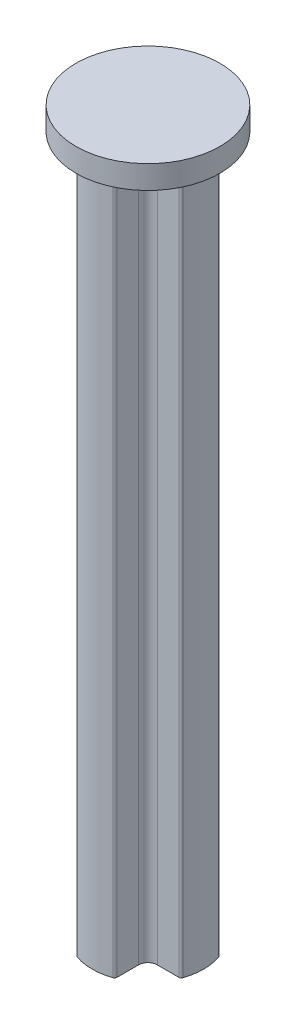
ISO-10303-21;
HEADER;
FILE_DESCRIPTION(('STEP AP214'),'2;1');
FILE_NAME('part.step','',(''),(''),'','','');
FILE_SCHEMA(('AUTOMOTIVE_DESIGN { 1 0 10303 214 1 1 1 1 }'));
ENDSEC;
DATA;
#1=APPLICATION_CONTEXT('core data for automotive mechanical design processes');
#2=APPLICATION_PROTOCOL_DEFINITION('international standard','automotive_design',2000,#1);
#3=PRODUCT_CONTEXT('',#1,'mechanical');
#4=PRODUCT('Part','Part','',(#3));
#5=PRODUCT_RELATED_PRODUCT_CATEGORY('part','',(#4));
#6=PRODUCT_DEFINITION_FORMATION('','',#4);
#7=PRODUCT_DEFINITION_CONTEXT('part definition',#1,'design');
#8=PRODUCT_DEFINITION('design','',#6,#7);
#9=PRODUCT_DEFINITION_SHAPE('','',#8);
#10=(LENGTH_UNIT() NAMED_UNIT(*) SI_UNIT(.MILLI.,.METRE.));
#11=(NAMED_UNIT(*) PLANE_ANGLE_UNIT() SI_UNIT($,.RADIAN.));
#12=(NAMED_UNIT(*) SI_UNIT($,.STERADIAN.) SOLID_ANGLE_UNIT());
#13=UNCERTAINTY_MEASURE_WITH_UNIT(LENGTH_MEASURE(1.E-05),#10,'distance_accuracy_value','');
#14=(GEOMETRIC_REPRESENTATION_CONTEXT(3) GLOBAL_UNCERTAINTY_ASSIGNED_CONTEXT((#13)) GLOBAL_UNIT_ASSIGNED_CONTEXT((#10,
#11,#12)) REPRESENTATION_CONTEXT('',''));
#15=CARTESIAN_POINT('',(0.,0.,0.));
#16=DIRECTION('',(0.,0.,1.));
#17=DIRECTION('',(1.,0.,0.));
#18=AXIS2_PLACEMENT_3D('',#15,#16,#17);
#19=CARTESIAN_POINT('',(0.,31.,0.));
#20=DIRECTION('',(0.,-1.,0.));
#21=DIRECTION('',(0.,0.,-1.));
#22=AXIS2_PLACEMENT_3D('',#19,#20,#21);
#23=CYLINDRICAL_SURFACE('',#22,3.1);
#24=CARTESIAN_POINT('',(0.,30.,0.));
#25=DIRECTION('',(0.,1.,0.));
#26=DIRECTION('',(0.,0.,1.));
#27=AXIS2_PLACEMENT_3D('',#24,#25,#26);
#28=CIRCLE('',#27,3.1);
#29=CARTESIAN_POINT('',(0.,30.,3.1));
#30=VERTEX_POINT('',#29);
#31=EDGE_CURVE('E47',#30,#30,#28,.T.);
#32=ORIENTED_EDGE('',*,*,#31,.T.);
#33=EDGE_LOOP('',(#32));
#34=FACE_BOUND('',#33,.T.);
#35=CARTESIAN_POINT('',(0.,31.,0.));
#36=DIRECTION('',(0.,1.,0.));
#37=DIRECTION('',(0.,0.,1.));
#38=AXIS2_PLACEMENT_3D('',#35,#36,#37);
#39=CIRCLE('',#38,3.1);
#40=CARTESIAN_POINT('',(0.,31.,3.1));
#41=VERTEX_POINT('',#40);
#42=EDGE_CURVE('E11',#41,#41,#39,.T.);
#43=ORIENTED_EDGE('',*,*,#42,.F.);
#44=EDGE_LOOP('',(#43));
#45=FACE_BOUND('',#44,.T.);
#46=ADVANCED_FACE('F39',(#34,#45),#23,.T.);
#47=CARTESIAN_POINT('',(0.,31.,0.));
#48=DIRECTION('',(0.,1.,0.));
#49=DIRECTION('',(0.,0.,1.));
#50=AXIS2_PLACEMENT_3D('',#47,#48,#49);
#51=PLANE('',#50);
#52=ORIENTED_EDGE('',*,*,#42,.T.);
#53=EDGE_LOOP('',(#52));
#54=FACE_BOUND('',#53,.T.);
#55=ADVANCED_FACE('F455',(#54),#51,.T.);
#56=CARTESIAN_POINT('',(0.,30.,0.));
#57=DIRECTION('',(0.,1.,0.));
#58=DIRECTION('',(0.,0.,1.));
#59=AXIS2_PLACEMENT_3D('',#56,#57,#58);
#60=PLANE('',#59);
#61=ORIENTED_EDGE('',*,*,#31,.F.);
#62=EDGE_LOOP('',(#61));
#63=FACE_BOUND('',#62,.T.);
#64=CARTESIAN_POINT('',(0.,30.,0.));
#65=DIRECTION('',(0.,1.,0.));
#66=DIRECTION('',(0.,0.,1.));
#67=AXIS2_PLACEMENT_3D('',#64,#65,#66);
#68=CIRCLE('',#67,2.4);
#69=CARTESIAN_POINT('',(-2.27238804961105,30.,-0.772173913043479));
#70=VERTEX_POINT('',#69);
#71=CARTESIAN_POINT('',(-2.27238804961105,30.,0.772173913043478));
#72=VERTEX_POINT('',#71);
#73=EDGE_CURVE('E202',#70,#72,#68,.T.);
#74=ORIENTED_EDGE('',*,*,#73,.T.);
#75=CARTESIAN_POINT('',(-2.17770521421059,30.,0.74));
#76=DIRECTION('',(0.,1.,0.));
#77=DIRECTION('',(0.,0.,1.));
#78=AXIS2_PLACEMENT_3D('',#75,#76,#77);
#79=CIRCLE('',#78,0.0999999999999996);
#80=CARTESIAN_POINT('',(-2.17770521421059,30.,0.84));
#81=VERTEX_POINT('',#80);
#82=EDGE_CURVE('E225',#72,#81,#79,.T.);
#83=ORIENTED_EDGE('',*,*,#82,.T.);
#84=DIRECTION('',(1.,0.,0.));
#85=VECTOR('',#84,1.);
#86=CARTESIAN_POINT('',(-2.17770521421059,30.,0.84));
#87=LINE('',#86,#85);
#88=CARTESIAN_POINT('',(-1.24,30.,0.84));
#89=VERTEX_POINT('',#88);
#90=EDGE_CURVE('E228',#81,#89,#87,.T.);
#91=ORIENTED_EDGE('',*,*,#90,.T.);
#92=CARTESIAN_POINT('',(-1.24,30.,1.24));
#93=DIRECTION('',(0.,-1.,0.));
#94=DIRECTION('',(0.,0.,1.));
#95=AXIS2_PLACEMENT_3D('',#92,#93,#94);
#96=CIRCLE('',#95,0.4);
#97=CARTESIAN_POINT('',(-0.84,30.,1.24));
#98=VERTEX_POINT('',#97);
#99=EDGE_CURVE('E233',#89,#98,#96,.T.);
#100=ORIENTED_EDGE('',*,*,#99,.T.);
#101=DIRECTION('',(0.,0.,1.));
#102=VECTOR('',#101,1.);
#103=CARTESIAN_POINT('',(-0.84,30.,1.24));
#104=LINE('',#103,#102);
#105=CARTESIAN_POINT('',(-0.84,30.,2.17770521421059));
#106=VERTEX_POINT('',#105);
#107=EDGE_CURVE('E236',#98,#106,#104,.T.);
#108=ORIENTED_EDGE('',*,*,#107,.T.);
#109=CARTESIAN_POINT('',(-0.74,30.,2.17770521421059));
#110=DIRECTION('',(0.,1.,0.));
#111=DIRECTION('',(0.,0.,1.));
#112=AXIS2_PLACEMENT_3D('',#109,#110,#111);
#113=CIRCLE('',#112,0.1);
#114=CARTESIAN_POINT('',(-0.772173913043479,30.,2.27238804961105));
#115=VERTEX_POINT('',#114);
#116=EDGE_CURVE('E239',#106,#115,#113,.T.);
#117=ORIENTED_EDGE('',*,*,#116,.T.);
#118=CARTESIAN_POINT('',(0.,30.,0.));
#119=DIRECTION('',(0.,1.,0.));
#120=DIRECTION('',(0.,0.,1.));
#121=AXIS2_PLACEMENT_3D('',#118,#119,#120);
#122=CIRCLE('',#121,2.4);
#123=CARTESIAN_POINT('',(0.772173913043478,30.,2.27238804961105));
#124=VERTEX_POINT('',#123);
#125=EDGE_CURVE('E242',#115,#124,#122,.T.);
#126=ORIENTED_EDGE('',*,*,#125,.T.);
#127=CARTESIAN_POINT('',(0.74,30.,2.17770521421059));
#128=DIRECTION('',(0.,1.,0.));
#129=DIRECTION('',(0.,0.,1.));
#130=AXIS2_PLACEMENT_3D('',#127,#128,#129);
#131=CIRCLE('',#130,0.1);
#132=CARTESIAN_POINT('',(0.84,30.,2.17770521421059));
#133=VERTEX_POINT('',#132);
#134=EDGE_CURVE('E245',#124,#133,#131,.T.);
#135=ORIENTED_EDGE('',*,*,#134,.T.);
#136=DIRECTION('',(0.,0.,-1.));
#137=VECTOR('',#136,1.);
#138=CARTESIAN_POINT('',(0.84,30.,1.24));
#139=LINE('',#138,#137);
#140=CARTESIAN_POINT('',(0.84,30.,1.24));
#141=VERTEX_POINT('',#140);
#142=EDGE_CURVE('E248',#133,#141,#139,.T.);
#143=ORIENTED_EDGE('',*,*,#142,.T.);
#144=CARTESIAN_POINT('',(1.24,30.,1.24));
#145=DIRECTION('',(0.,-1.,0.));
#146=DIRECTION('',(0.,0.,-1.));
#147=AXIS2_PLACEMENT_3D('',#144,#145,#146);
#148=CIRCLE('',#147,0.4);
#149=CARTESIAN_POINT('',(1.24,30.,0.84));
#150=VERTEX_POINT('',#149);
#151=EDGE_CURVE('E251',#141,#150,#148,.T.);
#152=ORIENTED_EDGE('',*,*,#151,.T.);
#153=DIRECTION('',(1.,0.,0.));
#154=VECTOR('',#153,1.);
#155=CARTESIAN_POINT('',(1.24,30.,0.84));
#156=LINE('',#155,#154);
#157=CARTESIAN_POINT('',(2.17770521421059,30.,0.84));
#158=VERTEX_POINT('',#157);
#159=EDGE_CURVE('E254',#150,#158,#156,.T.);
#160=ORIENTED_EDGE('',*,*,#159,.T.);
#161=CARTESIAN_POINT('',(2.17770521421059,30.,0.74));
#162=DIRECTION('',(0.,1.,0.));
#163=DIRECTION('',(0.,0.,1.));
#164=AXIS2_PLACEMENT_3D('',#161,#162,#163);
#165=CIRCLE('',#164,0.0999999999999996);
#166=CARTESIAN_POINT('',(2.27238804961105,30.,0.772173913043478));
#167=VERTEX_POINT('',#166);
#168=EDGE_CURVE('E257',#158,#167,#165,.T.);
#169=ORIENTED_EDGE('',*,*,#168,.T.);
#170=CARTESIAN_POINT('',(0.,30.,0.));
#171=DIRECTION('',(0.,1.,0.));
#172=DIRECTION('',(0.,0.,1.));
#173=AXIS2_PLACEMENT_3D('',#170,#171,#172);
#174=CIRCLE('',#173,2.4);
#175=CARTESIAN_POINT('',(2.27238804961105,30.,-0.772173913043478));
#176=VERTEX_POINT('',#175);
#177=EDGE_CURVE('E260',#167,#176,#174,.T.);
#178=ORIENTED_EDGE('',*,*,#177,.T.);
#179=CARTESIAN_POINT('',(2.17770521421059,30.,-0.74));
#180=DIRECTION('',(0.,1.,0.));
#181=DIRECTION('',(0.,0.,-1.));
#182=AXIS2_PLACEMENT_3D('',#179,#180,#181);
#183=CIRCLE('',#182,0.1);
#184=CARTESIAN_POINT('',(2.17770521421059,30.,-0.84));
#185=VERTEX_POINT('',#184);
#186=EDGE_CURVE('E263',#176,#185,#183,.T.);
#187=ORIENTED_EDGE('',*,*,#186,.T.);
#188=DIRECTION('',(-1.,0.,0.));
#189=VECTOR('',#188,1.);
#190=CARTESIAN_POINT('',(1.24,30.,-0.84));
#191=LINE('',#190,#189);
#192=CARTESIAN_POINT('',(1.24,30.,-0.84));
#193=VERTEX_POINT('',#192);
#194=EDGE_CURVE('E266',#185,#193,#191,.T.);
#195=ORIENTED_EDGE('',*,*,#194,.T.);
#196=CARTESIAN_POINT('',(1.24,30.,-1.24));
#197=DIRECTION('',(0.,-1.,0.));
#198=DIRECTION('',(0.,0.,1.));
#199=AXIS2_PLACEMENT_3D('',#196,#197,#198);
#200=CIRCLE('',#199,0.4);
#201=CARTESIAN_POINT('',(0.84,30.,-1.24));
#202=VERTEX_POINT('',#201);
#203=EDGE_CURVE('E269',#193,#202,#200,.T.);
#204=ORIENTED_EDGE('',*,*,#203,.T.);
#205=DIRECTION('',(0.,0.,-1.));
#206=VECTOR('',#205,1.);
#207=CARTESIAN_POINT('',(0.84,30.,-2.17770521421059));
#208=LINE('',#207,#206);
#209=CARTESIAN_POINT('',(0.84,30.,-2.17770521421059));
#210=VERTEX_POINT('',#209);
#211=EDGE_CURVE('E272',#202,#210,#208,.T.);
#212=ORIENTED_EDGE('',*,*,#211,.T.);
#213=CARTESIAN_POINT('',(0.74,30.,-2.17770521421059));
#214=DIRECTION('',(0.,1.,0.));
#215=DIRECTION('',(0.,0.,-1.));
#216=AXIS2_PLACEMENT_3D('',#213,#214,#215);
#217=CIRCLE('',#216,0.1);
#218=CARTESIAN_POINT('',(0.772173913043478,30.,-2.27238804961105));
#219=VERTEX_POINT('',#218);
#220=EDGE_CURVE('E275',#210,#219,#217,.T.);
#221=ORIENTED_EDGE('',*,*,#220,.T.);
#222=CARTESIAN_POINT('',(0.,30.,0.));
#223=DIRECTION('',(0.,1.,0.));
#224=DIRECTION('',(0.,0.,1.));
#225=AXIS2_PLACEMENT_3D('',#222,#223,#224);
#226=CIRCLE('',#225,2.4);
#227=CARTESIAN_POINT('',(-0.772173913043478,30.,-2.27238804961105));
#228=VERTEX_POINT('',#227);
#229=EDGE_CURVE('E278',#219,#228,#226,.T.);
#230=ORIENTED_EDGE('',*,*,#229,.T.);
#231=CARTESIAN_POINT('',(-0.74,30.,-2.17770521421059));
#232=DIRECTION('',(0.,1.,0.));
#233=DIRECTION('',(0.,0.,1.));
#234=AXIS2_PLACEMENT_3D('',#231,#232,#233);
#235=CIRCLE('',#234,0.1);
#236=CARTESIAN_POINT('',(-0.84,30.,-2.17770521421059));
#237=VERTEX_POINT('',#236);
#238=EDGE_CURVE('E281',#228,#237,#235,.T.);
#239=ORIENTED_EDGE('',*,*,#238,.T.);
#240=DIRECTION('',(0.,0.,1.));
#241=VECTOR('',#240,1.);
#242=CARTESIAN_POINT('',(-0.84,30.,-2.17770521421059));
#243=LINE('',#242,#241);
#244=CARTESIAN_POINT('',(-0.84,30.,-1.24));
#245=VERTEX_POINT('',#244);
#246=EDGE_CURVE('E284',#237,#245,#243,.T.);
#247=ORIENTED_EDGE('',*,*,#246,.T.);
#248=CARTESIAN_POINT('',(-1.24,30.,-1.24));
#249=DIRECTION('',(0.,-1.,0.));
#250=DIRECTION('',(0.,0.,-1.));
#251=AXIS2_PLACEMENT_3D('',#248,#249,#250);
#252=CIRCLE('',#251,0.4);
#253=CARTESIAN_POINT('',(-1.24,30.,-0.84));
#254=VERTEX_POINT('',#253);
#255=EDGE_CURVE('E287',#245,#254,#252,.T.);
#256=ORIENTED_EDGE('',*,*,#255,.T.);
#257=DIRECTION('',(-1.,0.,0.));
#258=VECTOR('',#257,1.);
#259=CARTESIAN_POINT('',(-2.17770521421059,30.,-0.84));
#260=LINE('',#259,#258);
#261=CARTESIAN_POINT('',(-2.17770521421059,30.,-0.84));
#262=VERTEX_POINT('',#261);
#263=EDGE_CURVE('E205',#254,#262,#260,.T.);
#264=ORIENTED_EDGE('',*,*,#263,.T.);
#265=CARTESIAN_POINT('',(-2.17770521421059,30.,-0.74));
#266=DIRECTION('',(0.,1.,0.));
#267=DIRECTION('',(0.,0.,1.));
#268=AXIS2_PLACEMENT_3D('',#265,#266,#267);
#269=CIRCLE('',#268,0.1);
#270=EDGE_CURVE('E198',#262,#70,#269,.T.);
#271=ORIENTED_EDGE('',*,*,#270,.T.);
#272=EDGE_LOOP('',(#74,#83,#91,#100,#108,#117,#126,#135,#143,#152,#160,#169,#178,#187,#195,#204,
#212,#221,#230,#239,#247,#256,#264,#271));
#273=FACE_BOUND('',#272,.T.);
#274=ADVANCED_FACE('F200',(#63,#273),#60,.F.);
#275=CARTESIAN_POINT('',(-2.17770521421059,30.,-0.74));
#276=DIRECTION('',(0.,-1.,0.));
#277=DIRECTION('',(0.,0.,-1.));
#278=AXIS2_PLACEMENT_3D('',#275,#276,#277);
#279=CYLINDRICAL_SURFACE('',#278,0.1);
#280=CARTESIAN_POINT('',(-2.17770521421059,0.,-0.74));
#281=DIRECTION('',(0.,1.,0.));
#282=DIRECTION('',(0.,0.,1.));
#283=AXIS2_PLACEMENT_3D('',#280,#281,#282);
#284=CIRCLE('',#283,0.1);
#285=CARTESIAN_POINT('',(-2.17770521421059,0.,-0.84));
#286=VERTEX_POINT('',#285);
#287=CARTESIAN_POINT('',(-2.27238804961105,0.,-0.772173913043479));
#288=VERTEX_POINT('',#287);
#289=EDGE_CURVE('E215',#286,#288,#284,.T.);
#290=ORIENTED_EDGE('',*,*,#289,.T.);
#291=DIRECTION('',(0.,-1.,0.));
#292=VECTOR('',#291,1.);
#293=CARTESIAN_POINT('',(-2.27238804961105,30.,-0.772173913043479));
#294=LINE('',#293,#292);
#295=EDGE_CURVE('E212',#70,#288,#294,.T.);
#296=ORIENTED_EDGE('',*,*,#295,.F.);
#297=ORIENTED_EDGE('',*,*,#270,.F.);
#298=DIRECTION('',(0.,-1.,0.));
#299=VECTOR('',#298,1.);
#300=CARTESIAN_POINT('',(-2.17770521421059,30.,-0.84));
#301=LINE('',#300,#299);
#302=EDGE_CURVE('E292',#262,#286,#301,.T.);
#303=ORIENTED_EDGE('',*,*,#302,.T.);
#304=EDGE_LOOP('',(#290,#296,#297,#303));
#305=FACE_BOUND('',#304,.T.);
#306=ADVANCED_FACE('F213',(#305),#279,.T.);
#307=CARTESIAN_POINT('',(0.,30.,0.));
#308=DIRECTION('',(0.,-1.,0.));
#309=DIRECTION('',(0.,0.,-1.));
#310=AXIS2_PLACEMENT_3D('',#307,#308,#309);
#311=CYLINDRICAL_SURFACE('',#310,2.4);
#312=CARTESIAN_POINT('',(0.,0.,0.));
#313=DIRECTION('',(0.,1.,0.));
#314=DIRECTION('',(0.,0.,1.));
#315=AXIS2_PLACEMENT_3D('',#312,#313,#314);
#316=CIRCLE('',#315,2.4);
#317=CARTESIAN_POINT('',(-2.27238804961105,0.,0.772173913043478));
#318=VERTEX_POINT('',#317);
#319=EDGE_CURVE('E295',#288,#318,#316,.T.);
#320=ORIENTED_EDGE('',*,*,#319,.T.);
#321=DIRECTION('',(0.,-1.,0.));
#322=VECTOR('',#321,1.);
#323=CARTESIAN_POINT('',(-2.27238804961105,30.,0.772173913043478));
#324=LINE('',#323,#322);
#325=EDGE_CURVE('E220',#72,#318,#324,.T.);
#326=ORIENTED_EDGE('',*,*,#325,.F.);
#327=ORIENTED_EDGE('',*,*,#73,.F.);
#328=ORIENTED_EDGE('',*,*,#295,.T.);
#329=EDGE_LOOP('',(#320,#326,#327,#328));
#330=FACE_BOUND('',#329,.T.);
#331=ADVANCED_FACE('F222',(#330),#311,.T.);
#332=CARTESIAN_POINT('',(-2.17770521421059,30.,0.74));
#333=DIRECTION('',(0.,-1.,0.));
#334=DIRECTION('',(0.,0.,-1.));
#335=AXIS2_PLACEMENT_3D('',#332,#333,#334);
#336=CYLINDRICAL_SURFACE('',#335,0.0999999999999996);
#337=CARTESIAN_POINT('',(-2.17770521421059,0.,0.74));
#338=DIRECTION('',(0.,1.,0.));
#339=DIRECTION('',(0.,0.,1.));
#340=AXIS2_PLACEMENT_3D('',#337,#338,#339);
#341=CIRCLE('',#340,0.0999999999999996);
#342=CARTESIAN_POINT('',(-2.17770521421059,0.,0.84));
#343=VERTEX_POINT('',#342);
#344=EDGE_CURVE('E298',#318,#343,#341,.T.);
#345=ORIENTED_EDGE('',*,*,#344,.T.);
#346=DIRECTION('',(0.,-1.,0.));
#347=VECTOR('',#346,1.);
#348=CARTESIAN_POINT('',(-2.17770521421059,30.,0.84));
#349=LINE('',#348,#347);
#350=EDGE_CURVE('E444',#81,#343,#349,.T.);
#351=ORIENTED_EDGE('',*,*,#350,.F.);
#352=ORIENTED_EDGE('',*,*,#82,.F.);
#353=ORIENTED_EDGE('',*,*,#325,.T.);
#354=EDGE_LOOP('',(#345,#351,#352,#353));
#355=FACE_BOUND('',#354,.T.);
#356=ADVANCED_FACE('F502',(#355),#336,.T.);
#357=CARTESIAN_POINT('',(-2.17770521421059,30.,0.84));
#358=DIRECTION('',(0.,0.,-1.));
#359=DIRECTION('',(-1.,0.,0.));
#360=AXIS2_PLACEMENT_3D('',#357,#358,#359);
#361=PLANE('',#360);
#362=DIRECTION('',(1.,0.,0.));
#363=VECTOR('',#362,1.);
#364=CARTESIAN_POINT('',(-2.17770521421059,0.,0.84));
#365=LINE('',#364,#363);
#366=CARTESIAN_POINT('',(-1.24,0.,0.84));
#367=VERTEX_POINT('',#366);
#368=EDGE_CURVE('E302',#343,#367,#365,.T.);
#369=ORIENTED_EDGE('',*,*,#368,.T.);
#370=DIRECTION('',(0.,-1.,0.));
#371=VECTOR('',#370,1.);
#372=CARTESIAN_POINT('',(-1.24,30.,0.84));
#373=LINE('',#372,#371);
#374=EDGE_CURVE('E441',#89,#367,#373,.T.);
#375=ORIENTED_EDGE('',*,*,#374,.F.);
#376=ORIENTED_EDGE('',*,*,#90,.F.);
#377=ORIENTED_EDGE('',*,*,#350,.T.);
#378=EDGE_LOOP('',(#369,#375,#376,#377));
#379=FACE_BOUND('',#378,.T.);
#380=ADVANCED_FACE('F510',(#379),#361,.F.);
#381=CARTESIAN_POINT('',(-1.24,30.,1.24));
#382=DIRECTION('',(0.,-1.,0.));
#383=DIRECTION('',(0.,0.,-1.));
#384=AXIS2_PLACEMENT_3D('',#381,#382,#383);
#385=CYLINDRICAL_SURFACE('',#384,0.4);
#386=CARTESIAN_POINT('',(-1.24,0.,1.24));
#387=DIRECTION('',(0.,-1.,0.));
#388=DIRECTION('',(0.,0.,1.));
#389=AXIS2_PLACEMENT_3D('',#386,#387,#388);
#390=CIRCLE('',#389,0.4);
#391=CARTESIAN_POINT('',(-0.84,0.,1.24));
#392=VERTEX_POINT('',#391);
#393=EDGE_CURVE('E306',#367,#392,#390,.T.);
#394=ORIENTED_EDGE('',*,*,#393,.T.);
#395=DIRECTION('',(0.,-1.,0.));
#396=VECTOR('',#395,1.);
#397=CARTESIAN_POINT('',(-0.84,30.,1.24));
#398=LINE('',#397,#396);
#399=EDGE_CURVE('E438',#98,#392,#398,.T.);
#400=ORIENTED_EDGE('',*,*,#399,.F.);
#401=ORIENTED_EDGE('',*,*,#99,.F.);
#402=ORIENTED_EDGE('',*,*,#374,.T.);
#403=EDGE_LOOP('',(#394,#400,#401,#402));
#404=FACE_BOUND('',#403,.T.);
#405=ADVANCED_FACE('F519',(#404),#385,.F.);
#406=CARTESIAN_POINT('',(-0.84,30.,1.24));
#407=DIRECTION('',(1.,0.,0.));
#408=DIRECTION('',(0.,0.,-1.));
#409=AXIS2_PLACEMENT_3D('',#406,#407,#408);
#410=PLANE('',#409);
#411=DIRECTION('',(0.,0.,1.));
#412=VECTOR('',#411,1.);
#413=CARTESIAN_POINT('',(-0.84,0.,1.24));
#414=LINE('',#413,#412);
#415=CARTESIAN_POINT('',(-0.84,0.,2.17770521421059));
#416=VERTEX_POINT('',#415);
#417=EDGE_CURVE('E310',#392,#416,#414,.T.);
#418=ORIENTED_EDGE('',*,*,#417,.T.);
#419=DIRECTION('',(0.,-1.,0.));
#420=VECTOR('',#419,1.);
#421=CARTESIAN_POINT('',(-0.84,30.,2.17770521421059));
#422=LINE('',#421,#420);
#423=EDGE_CURVE('E435',#106,#416,#422,.T.);
#424=ORIENTED_EDGE('',*,*,#423,.F.);
#425=ORIENTED_EDGE('',*,*,#107,.F.);
#426=ORIENTED_EDGE('',*,*,#399,.T.);
#427=EDGE_LOOP('',(#418,#424,#425,#426));
#428=FACE_BOUND('',#427,.T.);
#429=ADVANCED_FACE('F528',(#428),#410,.F.);
#430=CARTESIAN_POINT('',(-0.74,30.,2.17770521421059));
#431=DIRECTION('',(0.,-1.,0.));
#432=DIRECTION('',(0.,0.,-1.));
#433=AXIS2_PLACEMENT_3D('',#430,#431,#432);
#434=CYLINDRICAL_SURFACE('',#433,0.1);
#435=CARTESIAN_POINT('',(-0.74,0.,2.17770521421059));
#436=DIRECTION('',(0.,1.,0.));
#437=DIRECTION('',(0.,0.,1.));
#438=AXIS2_PLACEMENT_3D('',#435,#436,#437);
#439=CIRCLE('',#438,0.1);
#440=CARTESIAN_POINT('',(-0.772173913043479,0.,2.27238804961105));
#441=VERTEX_POINT('',#440);
#442=EDGE_CURVE('E314',#416,#441,#439,.T.);
#443=ORIENTED_EDGE('',*,*,#442,.T.);
#444=DIRECTION('',(0.,-1.,0.));
#445=VECTOR('',#444,1.);
#446=CARTESIAN_POINT('',(-0.772173913043479,30.,2.27238804961105));
#447=LINE('',#446,#445);
#448=EDGE_CURVE('E432',#115,#441,#447,.T.);
#449=ORIENTED_EDGE('',*,*,#448,.F.);
#450=ORIENTED_EDGE('',*,*,#116,.F.);
#451=ORIENTED_EDGE('',*,*,#423,.T.);
#452=EDGE_LOOP('',(#443,#449,#450,#451));
#453=FACE_BOUND('',#452,.T.);
#454=ADVANCED_FACE('F537',(#453),#434,.T.);
#455=CARTESIAN_POINT('',(0.,30.,0.));
#456=DIRECTION('',(0.,-1.,0.));
#457=DIRECTION('',(0.,0.,-1.));
#458=AXIS2_PLACEMENT_3D('',#455,#456,#457);
#459=CYLINDRICAL_SURFACE('',#458,2.4);
#460=CARTESIAN_POINT('',(0.,0.,0.));
#461=DIRECTION('',(0.,1.,0.));
#462=DIRECTION('',(0.,0.,1.));
#463=AXIS2_PLACEMENT_3D('',#460,#461,#462);
#464=CIRCLE('',#463,2.4);
#465=CARTESIAN_POINT('',(0.772173913043478,0.,2.27238804961105));
#466=VERTEX_POINT('',#465);
#467=EDGE_CURVE('E318',#441,#466,#464,.T.);
#468=ORIENTED_EDGE('',*,*,#467,.T.);
#469=DIRECTION('',(0.,-1.,0.));
#470=VECTOR('',#469,1.);
#471=CARTESIAN_POINT('',(0.772173913043478,30.,2.27238804961105));
#472=LINE('',#471,#470);
#473=EDGE_CURVE('E429',#124,#466,#472,.T.);
#474=ORIENTED_EDGE('',*,*,#473,.F.);
#475=ORIENTED_EDGE('',*,*,#125,.F.);
#476=ORIENTED_EDGE('',*,*,#448,.T.);
#477=EDGE_LOOP('',(#468,#474,#475,#476));
#478=FACE_BOUND('',#477,.T.);
#479=ADVANCED_FACE('F546',(#478),#459,.T.);
#480=CARTESIAN_POINT('',(0.74,30.,2.17770521421059));
#481=DIRECTION('',(0.,-1.,0.));
#482=DIRECTION('',(0.,0.,-1.));
#483=AXIS2_PLACEMENT_3D('',#480,#481,#482);
#484=CYLINDRICAL_SURFACE('',#483,0.1);
#485=CARTESIAN_POINT('',(0.74,0.,2.17770521421059));
#486=DIRECTION('',(0.,1.,0.));
#487=DIRECTION('',(0.,0.,1.));
#488=AXIS2_PLACEMENT_3D('',#485,#486,#487);
#489=CIRCLE('',#488,0.1);
#490=CARTESIAN_POINT('',(0.84,0.,2.17770521421059));
#491=VERTEX_POINT('',#490);
#492=EDGE_CURVE('E322',#466,#491,#489,.T.);
#493=ORIENTED_EDGE('',*,*,#492,.T.);
#494=DIRECTION('',(0.,-1.,0.));
#495=VECTOR('',#494,1.);
#496=CARTESIAN_POINT('',(0.84,30.,2.17770521421059));
#497=LINE('',#496,#495);
#498=EDGE_CURVE('E426',#133,#491,#497,.T.);
#499=ORIENTED_EDGE('',*,*,#498,.F.);
#500=ORIENTED_EDGE('',*,*,#134,.F.);
#501=ORIENTED_EDGE('',*,*,#473,.T.);
#502=EDGE_LOOP('',(#493,#499,#500,#501));
#503=FACE_BOUND('',#502,.T.);
#504=ADVANCED_FACE('F555',(#503),#484,.T.);
#505=CARTESIAN_POINT('',(0.84,30.,1.24));
#506=DIRECTION('',(-1.,0.,0.));
#507=DIRECTION('',(0.,0.,1.));
#508=AXIS2_PLACEMENT_3D('',#505,#506,#507);
#509=PLANE('',#508);
#510=DIRECTION('',(0.,0.,-1.));
#511=VECTOR('',#510,1.);
#512=CARTESIAN_POINT('',(0.84,0.,1.24));
#513=LINE('',#512,#511);
#514=CARTESIAN_POINT('',(0.84,0.,1.24));
#515=VERTEX_POINT('',#514);
#516=EDGE_CURVE('E326',#491,#515,#513,.T.);
#517=ORIENTED_EDGE('',*,*,#516,.T.);
#518=DIRECTION('',(0.,-1.,0.));
#519=VECTOR('',#518,1.);
#520=CARTESIAN_POINT('',(0.84,30.,1.24));
#521=LINE('',#520,#519);
#522=EDGE_CURVE('E423',#141,#515,#521,.T.);
#523=ORIENTED_EDGE('',*,*,#522,.F.);
#524=ORIENTED_EDGE('',*,*,#142,.F.);
#525=ORIENTED_EDGE('',*,*,#498,.T.);
#526=EDGE_LOOP('',(#517,#523,#524,#525));
#527=FACE_BOUND('',#526,.T.);
#528=ADVANCED_FACE('F564',(#527),#509,.F.);
#529=CARTESIAN_POINT('',(1.24,30.,1.24));
#530=DIRECTION('',(0.,-1.,0.));
#531=DIRECTION('',(0.,0.,-1.));
#532=AXIS2_PLACEMENT_3D('',#529,#530,#531);
#533=CYLINDRICAL_SURFACE('',#532,0.4);
#534=CARTESIAN_POINT('',(1.24,0.,1.24));
#535=DIRECTION('',(0.,-1.,0.));
#536=DIRECTION('',(0.,0.,-1.));
#537=AXIS2_PLACEMENT_3D('',#534,#535,#536);
#538=CIRCLE('',#537,0.4);
#539=CARTESIAN_POINT('',(1.24,0.,0.84));
#540=VERTEX_POINT('',#539);
#541=EDGE_CURVE('E330',#515,#540,#538,.T.);
#542=ORIENTED_EDGE('',*,*,#541,.T.);
#543=DIRECTION('',(0.,-1.,0.));
#544=VECTOR('',#543,1.);
#545=CARTESIAN_POINT('',(1.24,30.,0.84));
#546=LINE('',#545,#544);
#547=EDGE_CURVE('E420',#150,#540,#546,.T.);
#548=ORIENTED_EDGE('',*,*,#547,.F.);
#549=ORIENTED_EDGE('',*,*,#151,.F.);
#550=ORIENTED_EDGE('',*,*,#522,.T.);
#551=EDGE_LOOP('',(#542,#548,#549,#550));
#552=FACE_BOUND('',#551,.T.);
#553=ADVANCED_FACE('F573',(#552),#533,.F.);
#554=CARTESIAN_POINT('',(1.24,30.,0.84));
#555=DIRECTION('',(0.,0.,-1.));
#556=DIRECTION('',(-1.,0.,0.));
#557=AXIS2_PLACEMENT_3D('',#554,#555,#556);
#558=PLANE('',#557);
#559=DIRECTION('',(1.,0.,0.));
#560=VECTOR('',#559,1.);
#561=CARTESIAN_POINT('',(1.24,0.,0.84));
#562=LINE('',#561,#560);
#563=CARTESIAN_POINT('',(2.17770521421059,0.,0.84));
#564=VERTEX_POINT('',#563);
#565=EDGE_CURVE('E334',#540,#564,#562,.T.);
#566=ORIENTED_EDGE('',*,*,#565,.T.);
#567=DIRECTION('',(0.,-1.,0.));
#568=VECTOR('',#567,1.);
#569=CARTESIAN_POINT('',(2.17770521421059,30.,0.84));
#570=LINE('',#569,#568);
#571=EDGE_CURVE('E417',#158,#564,#570,.T.);
#572=ORIENTED_EDGE('',*,*,#571,.F.);
#573=ORIENTED_EDGE('',*,*,#159,.F.);
#574=ORIENTED_EDGE('',*,*,#547,.T.);
#575=EDGE_LOOP('',(#566,#572,#573,#574));
#576=FACE_BOUND('',#575,.T.);
#577=ADVANCED_FACE('F582',(#576),#558,.F.);
#578=CARTESIAN_POINT('',(2.17770521421059,30.,0.74));
#579=DIRECTION('',(0.,-1.,0.));
#580=DIRECTION('',(0.,0.,-1.));
#581=AXIS2_PLACEMENT_3D('',#578,#579,#580);
#582=CYLINDRICAL_SURFACE('',#581,0.0999999999999996);
#583=CARTESIAN_POINT('',(2.17770521421059,0.,0.74));
#584=DIRECTION('',(0.,1.,0.));
#585=DIRECTION('',(0.,0.,1.));
#586=AXIS2_PLACEMENT_3D('',#583,#584,#585);
#587=CIRCLE('',#586,0.0999999999999996);
#588=CARTESIAN_POINT('',(2.27238804961105,0.,0.772173913043478));
#589=VERTEX_POINT('',#588);
#590=EDGE_CURVE('E338',#564,#589,#587,.T.);
#591=ORIENTED_EDGE('',*,*,#590,.T.);
#592=DIRECTION('',(0.,-1.,0.));
#593=VECTOR('',#592,1.);
#594=CARTESIAN_POINT('',(2.27238804961105,30.,0.772173913043478));
#595=LINE('',#594,#593);
#596=EDGE_CURVE('E414',#167,#589,#595,.T.);
#597=ORIENTED_EDGE('',*,*,#596,.F.);
#598=ORIENTED_EDGE('',*,*,#168,.F.);
#599=ORIENTED_EDGE('',*,*,#571,.T.);
#600=EDGE_LOOP('',(#591,#597,#598,#599));
#601=FACE_BOUND('',#600,.T.);
#602=ADVANCED_FACE('F591',(#601),#582,.T.);
#603=CARTESIAN_POINT('',(0.,30.,0.));
#604=DIRECTION('',(0.,-1.,0.));
#605=DIRECTION('',(0.,0.,-1.));
#606=AXIS2_PLACEMENT_3D('',#603,#604,#605);
#607=CYLINDRICAL_SURFACE('',#606,2.4);
#608=CARTESIAN_POINT('',(0.,0.,0.));
#609=DIRECTION('',(0.,1.,0.));
#610=DIRECTION('',(0.,0.,1.));
#611=AXIS2_PLACEMENT_3D('',#608,#609,#610);
#612=CIRCLE('',#611,2.4);
#613=CARTESIAN_POINT('',(2.27238804961105,0.,-0.772173913043478));
#614=VERTEX_POINT('',#613);
#615=EDGE_CURVE('E342',#589,#614,#612,.T.);
#616=ORIENTED_EDGE('',*,*,#615,.T.);
#617=DIRECTION('',(0.,-1.,0.));
#618=VECTOR('',#617,1.);
#619=CARTESIAN_POINT('',(2.27238804961105,30.,-0.772173913043478));
#620=LINE('',#619,#618);
#621=EDGE_CURVE('E411',#176,#614,#620,.T.);
#622=ORIENTED_EDGE('',*,*,#621,.F.);
#623=ORIENTED_EDGE('',*,*,#177,.F.);
#624=ORIENTED_EDGE('',*,*,#596,.T.);
#625=EDGE_LOOP('',(#616,#622,#623,#624));
#626=FACE_BOUND('',#625,.T.);
#627=ADVANCED_FACE('F600',(#626),#607,.T.);
#628=CARTESIAN_POINT('',(2.17770521421059,30.,-0.74));
#629=DIRECTION('',(0.,-1.,0.));
#630=DIRECTION('',(0.,0.,-1.));
#631=AXIS2_PLACEMENT_3D('',#628,#629,#630);
#632=CYLINDRICAL_SURFACE('',#631,0.1);
#633=CARTESIAN_POINT('',(2.17770521421059,0.,-0.74));
#634=DIRECTION('',(0.,1.,0.));
#635=DIRECTION('',(0.,0.,-1.));
#636=AXIS2_PLACEMENT_3D('',#633,#634,#635);
#637=CIRCLE('',#636,0.1);
#638=CARTESIAN_POINT('',(2.17770521421059,0.,-0.84));
#639=VERTEX_POINT('',#638);
#640=EDGE_CURVE('E346',#614,#639,#637,.T.);
#641=ORIENTED_EDGE('',*,*,#640,.T.);
#642=DIRECTION('',(0.,-1.,0.));
#643=VECTOR('',#642,1.);
#644=CARTESIAN_POINT('',(2.17770521421059,30.,-0.84));
#645=LINE('',#644,#643);
#646=EDGE_CURVE('E408',#185,#639,#645,.T.);
#647=ORIENTED_EDGE('',*,*,#646,.F.);
#648=ORIENTED_EDGE('',*,*,#186,.F.);
#649=ORIENTED_EDGE('',*,*,#621,.T.);
#650=EDGE_LOOP('',(#641,#647,#648,#649));
#651=FACE_BOUND('',#650,.T.);
#652=ADVANCED_FACE('F609',(#651),#632,.T.);
#653=CARTESIAN_POINT('',(1.24,30.,-0.84));
#654=DIRECTION('',(0.,0.,1.));
#655=DIRECTION('',(1.,0.,0.));
#656=AXIS2_PLACEMENT_3D('',#653,#654,#655);
#657=PLANE('',#656);
#658=DIRECTION('',(-1.,0.,0.));
#659=VECTOR('',#658,1.);
#660=CARTESIAN_POINT('',(1.24,0.,-0.84));
#661=LINE('',#660,#659);
#662=CARTESIAN_POINT('',(1.24,0.,-0.84));
#663=VERTEX_POINT('',#662);
#664=EDGE_CURVE('E350',#639,#663,#661,.T.);
#665=ORIENTED_EDGE('',*,*,#664,.T.);
#666=DIRECTION('',(0.,-1.,0.));
#667=VECTOR('',#666,1.);
#668=CARTESIAN_POINT('',(1.24,30.,-0.84));
#669=LINE('',#668,#667);
#670=EDGE_CURVE('E405',#193,#663,#669,.T.);
#671=ORIENTED_EDGE('',*,*,#670,.F.);
#672=ORIENTED_EDGE('',*,*,#194,.F.);
#673=ORIENTED_EDGE('',*,*,#646,.T.);
#674=EDGE_LOOP('',(#665,#671,#672,#673));
#675=FACE_BOUND('',#674,.T.);
#676=ADVANCED_FACE('F618',(#675),#657,.F.);
#677=CARTESIAN_POINT('',(1.24,30.,-1.24));
#678=DIRECTION('',(0.,-1.,0.));
#679=DIRECTION('',(0.,0.,-1.));
#680=AXIS2_PLACEMENT_3D('',#677,#678,#679);
#681=CYLINDRICAL_SURFACE('',#680,0.4);
#682=CARTESIAN_POINT('',(1.24,0.,-1.24));
#683=DIRECTION('',(0.,-1.,0.));
#684=DIRECTION('',(0.,0.,1.));
#685=AXIS2_PLACEMENT_3D('',#682,#683,#684);
#686=CIRCLE('',#685,0.4);
#687=CARTESIAN_POINT('',(0.84,0.,-1.24));
#688=VERTEX_POINT('',#687);
#689=EDGE_CURVE('E354',#663,#688,#686,.T.);
#690=ORIENTED_EDGE('',*,*,#689,.T.);
#691=DIRECTION('',(0.,-1.,0.));
#692=VECTOR('',#691,1.);
#693=CARTESIAN_POINT('',(0.84,30.,-1.24));
#694=LINE('',#693,#692);
#695=EDGE_CURVE('E402',#202,#688,#694,.T.);
#696=ORIENTED_EDGE('',*,*,#695,.F.);
#697=ORIENTED_EDGE('',*,*,#203,.F.);
#698=ORIENTED_EDGE('',*,*,#670,.T.);
#699=EDGE_LOOP('',(#690,#696,#697,#698));
#700=FACE_BOUND('',#699,.T.);
#701=ADVANCED_FACE('F627',(#700),#681,.F.);
#702=CARTESIAN_POINT('',(0.84,30.,-2.17770521421059));
#703=DIRECTION('',(-1.,0.,0.));
#704=DIRECTION('',(0.,0.,1.));
#705=AXIS2_PLACEMENT_3D('',#702,#703,#704);
#706=PLANE('',#705);
#707=DIRECTION('',(0.,0.,-1.));
#708=VECTOR('',#707,1.);
#709=CARTESIAN_POINT('',(0.84,0.,-2.17770521421059));
#710=LINE('',#709,#708);
#711=CARTESIAN_POINT('',(0.84,0.,-2.17770521421059));
#712=VERTEX_POINT('',#711);
#713=EDGE_CURVE('E358',#688,#712,#710,.T.);
#714=ORIENTED_EDGE('',*,*,#713,.T.);
#715=DIRECTION('',(0.,-1.,0.));
#716=VECTOR('',#715,1.);
#717=CARTESIAN_POINT('',(0.84,30.,-2.17770521421059));
#718=LINE('',#717,#716);
#719=EDGE_CURVE('E399',#210,#712,#718,.T.);
#720=ORIENTED_EDGE('',*,*,#719,.F.);
#721=ORIENTED_EDGE('',*,*,#211,.F.);
#722=ORIENTED_EDGE('',*,*,#695,.T.);
#723=EDGE_LOOP('',(#714,#720,#721,#722));
#724=FACE_BOUND('',#723,.T.);
#725=ADVANCED_FACE('F636',(#724),#706,.F.);
#726=CARTESIAN_POINT('',(0.74,30.,-2.17770521421059));
#727=DIRECTION('',(0.,-1.,0.));
#728=DIRECTION('',(0.,0.,-1.));
#729=AXIS2_PLACEMENT_3D('',#726,#727,#728);
#730=CYLINDRICAL_SURFACE('',#729,0.1);
#731=CARTESIAN_POINT('',(0.74,0.,-2.17770521421059));
#732=DIRECTION('',(0.,1.,0.));
#733=DIRECTION('',(0.,0.,-1.));
#734=AXIS2_PLACEMENT_3D('',#731,#732,#733);
#735=CIRCLE('',#734,0.1);
#736=CARTESIAN_POINT('',(0.772173913043478,0.,-2.27238804961105));
#737=VERTEX_POINT('',#736);
#738=EDGE_CURVE('E362',#712,#737,#735,.T.);
#739=ORIENTED_EDGE('',*,*,#738,.T.);
#740=DIRECTION('',(0.,-1.,0.));
#741=VECTOR('',#740,1.);
#742=CARTESIAN_POINT('',(0.772173913043478,30.,-2.27238804961105));
#743=LINE('',#742,#741);
#744=EDGE_CURVE('E396',#219,#737,#743,.T.);
#745=ORIENTED_EDGE('',*,*,#744,.F.);
#746=ORIENTED_EDGE('',*,*,#220,.F.);
#747=ORIENTED_EDGE('',*,*,#719,.T.);
#748=EDGE_LOOP('',(#739,#745,#746,#747));
#749=FACE_BOUND('',#748,.T.);
#750=ADVANCED_FACE('F645',(#749),#730,.T.);
#751=CARTESIAN_POINT('',(0.,30.,0.));
#752=DIRECTION('',(0.,-1.,0.));
#753=DIRECTION('',(0.,0.,-1.));
#754=AXIS2_PLACEMENT_3D('',#751,#752,#753);
#755=CYLINDRICAL_SURFACE('',#754,2.4);
#756=CARTESIAN_POINT('',(0.,0.,0.));
#757=DIRECTION('',(0.,1.,0.));
#758=DIRECTION('',(0.,0.,1.));
#759=AXIS2_PLACEMENT_3D('',#756,#757,#758);
#760=CIRCLE('',#759,2.4);
#761=CARTESIAN_POINT('',(-0.772173913043478,0.,-2.27238804961105));
#762=VERTEX_POINT('',#761);
#763=EDGE_CURVE('E366',#737,#762,#760,.T.);
#764=ORIENTED_EDGE('',*,*,#763,.T.);
#765=DIRECTION('',(0.,-1.,0.));
#766=VECTOR('',#765,1.);
#767=CARTESIAN_POINT('',(-0.772173913043478,30.,-2.27238804961105));
#768=LINE('',#767,#766);
#769=EDGE_CURVE('E393',#228,#762,#768,.T.);
#770=ORIENTED_EDGE('',*,*,#769,.F.);
#771=ORIENTED_EDGE('',*,*,#229,.F.);
#772=ORIENTED_EDGE('',*,*,#744,.T.);
#773=EDGE_LOOP('',(#764,#770,#771,#772));
#774=FACE_BOUND('',#773,.T.);
#775=ADVANCED_FACE('F654',(#774),#755,.T.);
#776=CARTESIAN_POINT('',(-0.74,30.,-2.17770521421059));
#777=DIRECTION('',(0.,-1.,0.));
#778=DIRECTION('',(0.,0.,-1.));
#779=AXIS2_PLACEMENT_3D('',#776,#777,#778);
#780=CYLINDRICAL_SURFACE('',#779,0.1);
#781=CARTESIAN_POINT('',(-0.74,0.,-2.17770521421059));
#782=DIRECTION('',(0.,1.,0.));
#783=DIRECTION('',(0.,0.,1.));
#784=AXIS2_PLACEMENT_3D('',#781,#782,#783);
#785=CIRCLE('',#784,0.1);
#786=CARTESIAN_POINT('',(-0.84,0.,-2.17770521421059));
#787=VERTEX_POINT('',#786);
#788=EDGE_CURVE('E370',#762,#787,#785,.T.);
#789=ORIENTED_EDGE('',*,*,#788,.T.);
#790=DIRECTION('',(0.,-1.,0.));
#791=VECTOR('',#790,1.);
#792=CARTESIAN_POINT('',(-0.84,30.,-2.17770521421059));
#793=LINE('',#792,#791);
#794=EDGE_CURVE('E390',#237,#787,#793,.T.);
#795=ORIENTED_EDGE('',*,*,#794,.F.);
#796=ORIENTED_EDGE('',*,*,#238,.F.);
#797=ORIENTED_EDGE('',*,*,#769,.T.);
#798=EDGE_LOOP('',(#789,#795,#796,#797));
#799=FACE_BOUND('',#798,.T.);
#800=ADVANCED_FACE('F663',(#799),#780,.T.);
#801=CARTESIAN_POINT('',(-0.84,30.,-2.17770521421059));
#802=DIRECTION('',(1.,0.,0.));
#803=DIRECTION('',(0.,0.,-1.));
#804=AXIS2_PLACEMENT_3D('',#801,#802,#803);
#805=PLANE('',#804);
#806=DIRECTION('',(0.,0.,1.));
#807=VECTOR('',#806,1.);
#808=CARTESIAN_POINT('',(-0.84,0.,-2.17770521421059));
#809=LINE('',#808,#807);
#810=CARTESIAN_POINT('',(-0.84,0.,-1.24));
#811=VERTEX_POINT('',#810);
#812=EDGE_CURVE('E374',#787,#811,#809,.T.);
#813=ORIENTED_EDGE('',*,*,#812,.T.);
#814=DIRECTION('',(0.,-1.,0.));
#815=VECTOR('',#814,1.);
#816=CARTESIAN_POINT('',(-0.84,30.,-1.24));
#817=LINE('',#816,#815);
#818=EDGE_CURVE('E387',#245,#811,#817,.T.);
#819=ORIENTED_EDGE('',*,*,#818,.F.);
#820=ORIENTED_EDGE('',*,*,#246,.F.);
#821=ORIENTED_EDGE('',*,*,#794,.T.);
#822=EDGE_LOOP('',(#813,#819,#820,#821));
#823=FACE_BOUND('',#822,.T.);
#824=ADVANCED_FACE('F672',(#823),#805,.F.);
#825=CARTESIAN_POINT('',(-1.24,30.,-1.24));
#826=DIRECTION('',(0.,-1.,0.));
#827=DIRECTION('',(0.,0.,-1.));
#828=AXIS2_PLACEMENT_3D('',#825,#826,#827);
#829=CYLINDRICAL_SURFACE('',#828,0.4);
#830=CARTESIAN_POINT('',(-1.24,0.,-1.24));
#831=DIRECTION('',(0.,-1.,0.));
#832=DIRECTION('',(0.,0.,-1.));
#833=AXIS2_PLACEMENT_3D('',#830,#831,#832);
#834=CIRCLE('',#833,0.4);
#835=CARTESIAN_POINT('',(-1.24,0.,-0.84));
#836=VERTEX_POINT('',#835);
#837=EDGE_CURVE('E54',#811,#836,#834,.T.);
#838=ORIENTED_EDGE('',*,*,#837,.T.);
#839=DIRECTION('',(0.,-1.,0.));
#840=VECTOR('',#839,1.);
#841=CARTESIAN_POINT('',(-1.24,30.,-0.84));
#842=LINE('',#841,#840);
#843=EDGE_CURVE('E58',#254,#836,#842,.T.);
#844=ORIENTED_EDGE('',*,*,#843,.F.);
#845=ORIENTED_EDGE('',*,*,#255,.F.);
#846=ORIENTED_EDGE('',*,*,#818,.T.);
#847=EDGE_LOOP('',(#838,#844,#845,#846));
#848=FACE_BOUND('',#847,.T.);
#849=ADVANCED_FACE('F681',(#848),#829,.F.);
#850=CARTESIAN_POINT('',(-2.17770521421059,30.,-0.84));
#851=DIRECTION('',(0.,0.,1.));
#852=DIRECTION('',(1.,0.,0.));
#853=AXIS2_PLACEMENT_3D('',#850,#851,#852);
#854=PLANE('',#853);
#855=DIRECTION('',(-1.,0.,0.));
#856=VECTOR('',#855,1.);
#857=CARTESIAN_POINT('',(-2.17770521421059,0.,-0.84));
#858=LINE('',#857,#856);
#859=EDGE_CURVE('E209',#836,#286,#858,.T.);
#860=ORIENTED_EDGE('',*,*,#859,.T.);
#861=ORIENTED_EDGE('',*,*,#302,.F.);
#862=ORIENTED_EDGE('',*,*,#263,.F.);
#863=ORIENTED_EDGE('',*,*,#843,.T.);
#864=EDGE_LOOP('',(#860,#861,#862,#863));
#865=FACE_BOUND('',#864,.T.);
#866=ADVANCED_FACE('F484',(#865),#854,.F.);
#867=CARTESIAN_POINT('',(0.,0.,0.));
#868=DIRECTION('',(0.,1.,0.));
#869=DIRECTION('',(0.,0.,1.));
#870=AXIS2_PLACEMENT_3D('',#867,#868,#869);
#871=PLANE('',#870);
#872=ORIENTED_EDGE('',*,*,#319,.F.);
#873=ORIENTED_EDGE('',*,*,#289,.F.);
#874=ORIENTED_EDGE('',*,*,#859,.F.);
#875=ORIENTED_EDGE('',*,*,#837,.F.);
#876=ORIENTED_EDGE('',*,*,#812,.F.);
#877=ORIENTED_EDGE('',*,*,#788,.F.);
#878=ORIENTED_EDGE('',*,*,#763,.F.);
#879=ORIENTED_EDGE('',*,*,#738,.F.);
#880=ORIENTED_EDGE('',*,*,#713,.F.);
#881=ORIENTED_EDGE('',*,*,#689,.F.);
#882=ORIENTED_EDGE('',*,*,#664,.F.);
#883=ORIENTED_EDGE('',*,*,#640,.F.);
#884=ORIENTED_EDGE('',*,*,#615,.F.);
#885=ORIENTED_EDGE('',*,*,#590,.F.);
#886=ORIENTED_EDGE('',*,*,#565,.F.);
#887=ORIENTED_EDGE('',*,*,#541,.F.);
#888=ORIENTED_EDGE('',*,*,#516,.F.);
#889=ORIENTED_EDGE('',*,*,#492,.F.);
#890=ORIENTED_EDGE('',*,*,#467,.F.);
#891=ORIENTED_EDGE('',*,*,#442,.F.);
#892=ORIENTED_EDGE('',*,*,#417,.F.);
#893=ORIENTED_EDGE('',*,*,#393,.F.);
#894=ORIENTED_EDGE('',*,*,#368,.F.);
#895=ORIENTED_EDGE('',*,*,#344,.F.);
#896=EDGE_LOOP('',(#872,#873,#874,#875,#876,#877,#878,#879,#880,#881,#882,#883,#884,#885,#886,
#887,#888,#889,#890,#891,#892,#893,#894,#895));
#897=FACE_BOUND('',#896,.T.);
#898=ADVANCED_FACE('F478',(#897),#871,.F.);
#899=CLOSED_SHELL('',(#46,#55,#274,#306,#331,#356,#380,#405,#429,#454,#479,#504,#528,#553,#577,
#602,#627,#652,#676,#701,#725,#750,#775,#800,#824,#849,#866,#898));
#900=MANIFOLD_SOLID_BREP('B2',#899);
#901=ADVANCED_BREP_SHAPE_REPRESENTATION('',(#18,#900),#14);
#902=SHAPE_DEFINITION_REPRESENTATION(#9,#901);
ENDSEC;
END-ISO-10303-21;
